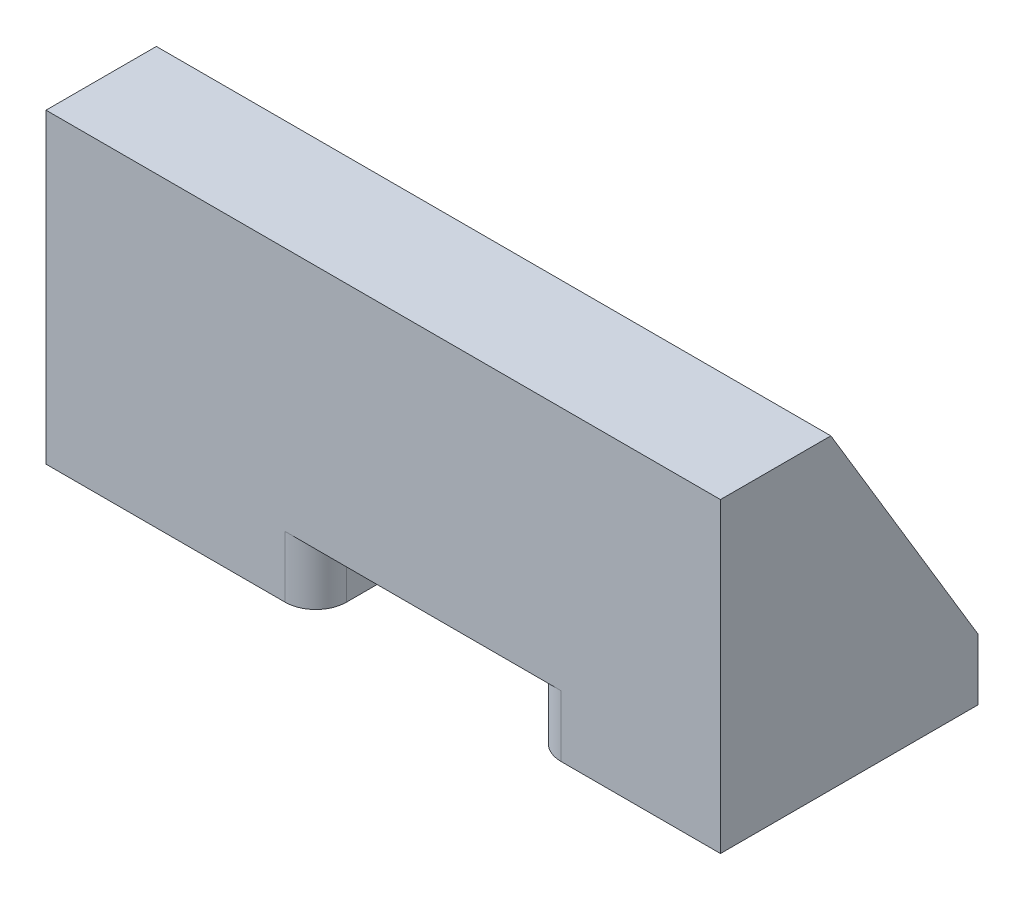
ISO-10303-21;
HEADER;
FILE_DESCRIPTION(('STEP AP214'),'2;1');
FILE_NAME('part.step','',(''),(''),'','','');
FILE_SCHEMA(('AUTOMOTIVE_DESIGN { 1 0 10303 214 1 1 1 1 }'));
ENDSEC;
DATA;
#1=APPLICATION_CONTEXT('core data for automotive mechanical design processes');
#2=APPLICATION_PROTOCOL_DEFINITION('international standard','automotive_design',2000,#1);
#3=PRODUCT_CONTEXT('',#1,'mechanical');
#4=PRODUCT('Part','Part','',(#3));
#5=PRODUCT_RELATED_PRODUCT_CATEGORY('part','',(#4));
#6=PRODUCT_DEFINITION_FORMATION('','',#4);
#7=PRODUCT_DEFINITION_CONTEXT('part definition',#1,'design');
#8=PRODUCT_DEFINITION('design','',#6,#7);
#9=PRODUCT_DEFINITION_SHAPE('','',#8);
#10=(LENGTH_UNIT() NAMED_UNIT(*) SI_UNIT(.MILLI.,.METRE.));
#11=(NAMED_UNIT(*) PLANE_ANGLE_UNIT() SI_UNIT($,.RADIAN.));
#12=(NAMED_UNIT(*) SI_UNIT($,.STERADIAN.) SOLID_ANGLE_UNIT());
#13=UNCERTAINTY_MEASURE_WITH_UNIT(LENGTH_MEASURE(1.E-05),#10,'distance_accuracy_value','');
#14=(GEOMETRIC_REPRESENTATION_CONTEXT(3) GLOBAL_UNCERTAINTY_ASSIGNED_CONTEXT((#13)) GLOBAL_UNIT_ASSIGNED_CONTEXT((#10,
#11,#12)) REPRESENTATION_CONTEXT('',''));
#15=CARTESIAN_POINT('',(0.,0.,0.));
#16=DIRECTION('',(0.,0.,1.));
#17=DIRECTION('',(1.,0.,0.));
#18=AXIS2_PLACEMENT_3D('',#15,#16,#17);
#19=CARTESIAN_POINT('',(0.,10.,0.));
#20=DIRECTION('',(0.,-1.,0.));
#21=DIRECTION('',(0.,0.,-1.));
#22=AXIS2_PLACEMENT_3D('',#19,#20,#21);
#23=PLANE('',#22);
#24=CARTESIAN_POINT('',(-45.,10.,-8.));
#25=DIRECTION('',(0.,1.,0.));
#26=DIRECTION('',(0.,0.,1.));
#27=AXIS2_PLACEMENT_3D('',#24,#25,#26);
#28=CIRCLE('',#27,3.99999999999999);
#29=CARTESIAN_POINT('',(-45.,10.,-4.00000000000001));
#30=VERTEX_POINT('',#29);
#31=EDGE_CURVE('E291',#30,#30,#28,.T.);
#32=ORIENTED_EDGE('',*,*,#31,.F.);
#33=EDGE_LOOP('',(#32));
#34=FACE_BOUND('',#33,.T.);
#35=CARTESIAN_POINT('',(-32.,10.,-3.));
#36=DIRECTION('',(0.,1.,0.));
#37=DIRECTION('',(0.,0.,1.));
#38=AXIS2_PLACEMENT_3D('',#35,#36,#37);
#39=CIRCLE('',#38,3.99999999999999);
#40=CARTESIAN_POINT('',(-32.,10.,0.99999999999999));
#41=VERTEX_POINT('',#40);
#42=EDGE_CURVE('E303',#41,#41,#39,.T.);
#43=ORIENTED_EDGE('',*,*,#42,.F.);
#44=EDGE_LOOP('',(#43));
#45=FACE_BOUND('',#44,.T.);
#46=CARTESIAN_POINT('',(32.,10.,-3.));
#47=DIRECTION('',(0.,1.,0.));
#48=DIRECTION('',(0.,0.,1.));
#49=AXIS2_PLACEMENT_3D('',#46,#47,#48);
#50=CIRCLE('',#49,4.);
#51=CARTESIAN_POINT('',(32.,10.,0.999999999999993));
#52=VERTEX_POINT('',#51);
#53=EDGE_CURVE('E315',#52,#52,#50,.T.);
#54=ORIENTED_EDGE('',*,*,#53,.F.);
#55=EDGE_LOOP('',(#54));
#56=FACE_BOUND('',#55,.T.);
#57=CARTESIAN_POINT('',(45.,10.,-8.));
#58=DIRECTION('',(0.,1.,0.));
#59=DIRECTION('',(0.,0.,1.));
#60=AXIS2_PLACEMENT_3D('',#57,#58,#59);
#61=CIRCLE('',#60,4.);
#62=CARTESIAN_POINT('',(45.,10.,-4.00000000000001));
#63=VERTEX_POINT('',#62);
#64=EDGE_CURVE('E327',#63,#63,#61,.T.);
#65=ORIENTED_EDGE('',*,*,#64,.F.);
#66=EDGE_LOOP('',(#65));
#67=FACE_BOUND('',#66,.T.);
#68=DIRECTION('',(0.,0.,-1.));
#69=VECTOR('',#68,1.);
#70=CARTESIAN_POINT('',(50.,10.,3.00000000000002));
#71=LINE('',#70,#69);
#72=CARTESIAN_POINT('',(50.,10.,3.00000000000002));
#73=VERTEX_POINT('',#72);
#74=CARTESIAN_POINT('',(50.,10.,-21.));
#75=VERTEX_POINT('',#74);
#76=EDGE_CURVE('E211',#73,#75,#71,.T.);
#77=ORIENTED_EDGE('',*,*,#76,.T.);
#78=DIRECTION('',(-1.,0.,0.));
#79=VECTOR('',#78,1.);
#80=CARTESIAN_POINT('',(-55.,10.,-21.));
#81=LINE('',#80,#79);
#82=CARTESIAN_POINT('',(-50.,10.,-21.));
#83=VERTEX_POINT('',#82);
#84=EDGE_CURVE('E343',#75,#83,#81,.T.);
#85=ORIENTED_EDGE('',*,*,#84,.T.);
#86=DIRECTION('',(0.,0.,1.));
#87=VECTOR('',#86,1.);
#88=CARTESIAN_POINT('',(-50.,10.,-21.));
#89=LINE('',#88,#87);
#90=CARTESIAN_POINT('',(-50.,10.,3.));
#91=VERTEX_POINT('',#90);
#92=EDGE_CURVE('E222',#83,#91,#89,.T.);
#93=ORIENTED_EDGE('',*,*,#92,.T.);
#94=DIRECTION('',(-1.,0.,0.));
#95=VECTOR('',#94,1.);
#96=CARTESIAN_POINT('',(-55.,10.,3.));
#97=LINE('',#96,#95);
#98=CARTESIAN_POINT('',(-16.,10.,3.));
#99=VERTEX_POINT('',#98);
#100=EDGE_CURVE('E387',#99,#91,#97,.T.);
#101=ORIENTED_EDGE('',*,*,#100,.F.);
#102=CARTESIAN_POINT('',(-16.,10.,8.));
#103=DIRECTION('',(0.,-1.,0.));
#104=DIRECTION('',(0.,0.,-1.));
#105=AXIS2_PLACEMENT_3D('',#102,#103,#104);
#106=CIRCLE('',#105,5.);
#107=CARTESIAN_POINT('',(-11.,10.,8.));
#108=VERTEX_POINT('',#107);
#109=EDGE_CURVE('E11',#99,#108,#106,.T.);
#110=ORIENTED_EDGE('',*,*,#109,.T.);
#111=DIRECTION('',(0.,0.,1.));
#112=VECTOR('',#111,1.);
#113=CARTESIAN_POINT('',(-11.,10.,-5.99999999999999));
#114=LINE('',#113,#112);
#115=CARTESIAN_POINT('',(-11.,10.,-5.99999999999999));
#116=VERTEX_POINT('',#115);
#117=EDGE_CURVE('E50',#116,#108,#114,.T.);
#118=ORIENTED_EDGE('',*,*,#117,.F.);
#119=CARTESIAN_POINT('',(-6.,10.,-6.));
#120=DIRECTION('',(0.,1.,0.));
#121=DIRECTION('',(0.,0.,1.));
#122=AXIS2_PLACEMENT_3D('',#119,#120,#121);
#123=CIRCLE('',#122,5.);
#124=CARTESIAN_POINT('',(-6.,10.,-11.));
#125=VERTEX_POINT('',#124);
#126=EDGE_CURVE('E250',#125,#116,#123,.T.);
#127=ORIENTED_EDGE('',*,*,#126,.F.);
#128=DIRECTION('',(-1.,0.,0.));
#129=VECTOR('',#128,1.);
#130=CARTESIAN_POINT('',(19.,10.,-11.));
#131=LINE('',#130,#129);
#132=CARTESIAN_POINT('',(19.,10.,-11.));
#133=VERTEX_POINT('',#132);
#134=EDGE_CURVE('E257',#133,#125,#131,.T.);
#135=ORIENTED_EDGE('',*,*,#134,.F.);
#136=CARTESIAN_POINT('',(19.,10.,-6.));
#137=DIRECTION('',(0.,1.,0.));
#138=DIRECTION('',(0.,0.,-1.));
#139=AXIS2_PLACEMENT_3D('',#136,#137,#138);
#140=CIRCLE('',#139,5.);
#141=CARTESIAN_POINT('',(24.,10.,-6.));
#142=VERTEX_POINT('',#141);
#143=EDGE_CURVE('E261',#142,#133,#140,.T.);
#144=ORIENTED_EDGE('',*,*,#143,.F.);
#145=DIRECTION('',(0.,0.,-1.));
#146=VECTOR('',#145,1.);
#147=CARTESIAN_POINT('',(24.,10.,21.));
#148=LINE('',#147,#146);
#149=CARTESIAN_POINT('',(24.,10.,8.));
#150=VERTEX_POINT('',#149);
#151=EDGE_CURVE('E264',#150,#142,#148,.T.);
#152=ORIENTED_EDGE('',*,*,#151,.F.);
#153=CARTESIAN_POINT('',(29.,10.,8.));
#154=DIRECTION('',(0.,-1.,0.));
#155=DIRECTION('',(0.,0.,-1.));
#156=AXIS2_PLACEMENT_3D('',#153,#154,#155);
#157=CIRCLE('',#156,5.);
#158=CARTESIAN_POINT('',(29.,10.,3.));
#159=VERTEX_POINT('',#158);
#160=EDGE_CURVE('E42',#150,#159,#157,.T.);
#161=ORIENTED_EDGE('',*,*,#160,.T.);
#162=EDGE_CURVE('E240',#73,#159,#97,.T.);
#163=ORIENTED_EDGE('',*,*,#162,.F.);
#164=EDGE_LOOP('',(#77,#85,#93,#101,#110,#118,#127,#135,#144,#152,#161,#163));
#165=FACE_BOUND('',#164,.T.);
#166=ADVANCED_FACE('F33',(#34,#45,#56,#67,#165),#23,.F.);
#167=CARTESIAN_POINT('',(-55.,50.,3.));
#168=DIRECTION('',(0.,0.,1.));
#169=DIRECTION('',(1.,0.,0.));
#170=AXIS2_PLACEMENT_3D('',#167,#168,#169);
#171=PLANE('',#170);
#172=ORIENTED_EDGE('',*,*,#162,.T.);
#173=DIRECTION('',(0.,-1.,0.));
#174=VECTOR('',#173,1.);
#175=CARTESIAN_POINT('',(29.,50.,3.));
#176=LINE('',#175,#174);
#177=CARTESIAN_POINT('',(29.,30.,3.));
#178=VERTEX_POINT('',#177);
#179=EDGE_CURVE('E393',#159,#178,#176,.F.);
#180=ORIENTED_EDGE('',*,*,#179,.T.);
#181=DIRECTION('',(1.,0.,0.));
#182=VECTOR('',#181,1.);
#183=CARTESIAN_POINT('',(-11.,30.,3.));
#184=LINE('',#183,#182);
#185=CARTESIAN_POINT('',(-16.,30.,3.));
#186=VERTEX_POINT('',#185);
#187=EDGE_CURVE('E391',#178,#186,#184,.F.);
#188=ORIENTED_EDGE('',*,*,#187,.T.);
#189=DIRECTION('',(0.,-1.,0.));
#190=VECTOR('',#189,1.);
#191=CARTESIAN_POINT('',(-16.,50.,3.));
#192=LINE('',#191,#190);
#193=EDGE_CURVE('E386',#186,#99,#192,.T.);
#194=ORIENTED_EDGE('',*,*,#193,.T.);
#195=ORIENTED_EDGE('',*,*,#100,.T.);
#196=DIRECTION('',(0.,1.,0.));
#197=VECTOR('',#196,1.);
#198=CARTESIAN_POINT('',(-50.,10.,3.));
#199=LINE('',#198,#197);
#200=CARTESIAN_POINT('',(-50.,50.,3.));
#201=VERTEX_POINT('',#200);
#202=EDGE_CURVE('E225',#91,#201,#199,.T.);
#203=ORIENTED_EDGE('',*,*,#202,.T.);
#204=DIRECTION('',(-1.,0.,0.));
#205=VECTOR('',#204,1.);
#206=CARTESIAN_POINT('',(-55.,50.,3.));
#207=LINE('',#206,#205);
#208=CARTESIAN_POINT('',(50.,50.,3.));
#209=VERTEX_POINT('',#208);
#210=EDGE_CURVE('E246',#209,#201,#207,.T.);
#211=ORIENTED_EDGE('',*,*,#210,.F.);
#212=DIRECTION('',(0.,-1.,0.));
#213=VECTOR('',#212,1.);
#214=CARTESIAN_POINT('',(50.,50.,3.));
#215=LINE('',#214,#213);
#216=EDGE_CURVE('E208',#209,#73,#215,.T.);
#217=ORIENTED_EDGE('',*,*,#216,.T.);
#218=EDGE_LOOP('',(#172,#180,#188,#194,#195,#203,#211,#217));
#219=FACE_BOUND('',#218,.T.);
#220=ADVANCED_FACE('F412',(#219),#171,.F.);
#221=CARTESIAN_POINT('',(55.,10.,21.));
#222=DIRECTION('',(-1.,0.,0.));
#223=DIRECTION('',(0.,0.,1.));
#224=AXIS2_PLACEMENT_3D('',#221,#222,#223);
#225=PLANE('',#224);
#226=DIRECTION('',(0.,0.,-1.));
#227=VECTOR('',#226,1.);
#228=CARTESIAN_POINT('',(55.,0.,21.));
#229=LINE('',#228,#227);
#230=CARTESIAN_POINT('',(55.,0.,21.));
#231=VERTEX_POINT('',#230);
#232=CARTESIAN_POINT('',(55.,0.,-21.));
#233=VERTEX_POINT('',#232);
#234=EDGE_CURVE('E339',#231,#233,#229,.T.);
#235=ORIENTED_EDGE('',*,*,#234,.T.);
#236=DIRECTION('',(0.,-1.,0.));
#237=VECTOR('',#236,1.);
#238=CARTESIAN_POINT('',(55.,10.,-21.));
#239=LINE('',#238,#237);
#240=CARTESIAN_POINT('',(55.,10.,-21.));
#241=VERTEX_POINT('',#240);
#242=EDGE_CURVE('E362',#241,#233,#239,.T.);
#243=ORIENTED_EDGE('',*,*,#242,.F.);
#244=DIRECTION('',(0.,0.857492925712544,0.514495755427527));
#245=VECTOR('',#244,1.);
#246=CARTESIAN_POINT('',(55.,10.,-21.));
#247=LINE('',#246,#245);
#248=CARTESIAN_POINT('',(55.,50.,3.));
#249=VERTEX_POINT('',#248);
#250=EDGE_CURVE('E206',#241,#249,#247,.T.);
#251=ORIENTED_EDGE('',*,*,#250,.T.);
#252=DIRECTION('',(0.,0.,-1.));
#253=VECTOR('',#252,1.);
#254=CARTESIAN_POINT('',(55.,50.,21.));
#255=LINE('',#254,#253);
#256=CARTESIAN_POINT('',(55.,50.,21.));
#257=VERTEX_POINT('',#256);
#258=EDGE_CURVE('E243',#257,#249,#255,.T.);
#259=ORIENTED_EDGE('',*,*,#258,.F.);
#260=DIRECTION('',(0.,-1.,0.));
#261=VECTOR('',#260,1.);
#262=CARTESIAN_POINT('',(55.,10.,21.));
#263=LINE('',#262,#261);
#264=EDGE_CURVE('E342',#257,#231,#263,.T.);
#265=ORIENTED_EDGE('',*,*,#264,.T.);
#266=EDGE_LOOP('',(#235,#243,#251,#259,#265));
#267=FACE_BOUND('',#266,.T.);
#268=ADVANCED_FACE('F481',(#267),#225,.F.);
#269=CARTESIAN_POINT('',(-55.,10.,-21.));
#270=DIRECTION('',(0.,0.,1.));
#271=DIRECTION('',(1.,0.,0.));
#272=AXIS2_PLACEMENT_3D('',#269,#270,#271);
#273=PLANE('',#272);
#274=DIRECTION('',(-1.,0.,0.));
#275=VECTOR('',#274,1.);
#276=CARTESIAN_POINT('',(-55.,0.,-21.));
#277=LINE('',#276,#275);
#278=CARTESIAN_POINT('',(-55.,0.,-21.));
#279=VERTEX_POINT('',#278);
#280=EDGE_CURVE('E346',#233,#279,#277,.T.);
#281=ORIENTED_EDGE('',*,*,#280,.T.);
#282=DIRECTION('',(0.,-1.,0.));
#283=VECTOR('',#282,1.);
#284=CARTESIAN_POINT('',(-55.,10.,-21.));
#285=LINE('',#284,#283);
#286=CARTESIAN_POINT('',(-55.,10.,-21.));
#287=VERTEX_POINT('',#286);
#288=EDGE_CURVE('E359',#287,#279,#285,.T.);
#289=ORIENTED_EDGE('',*,*,#288,.F.);
#290=DIRECTION('',(-1.,0.,0.));
#291=VECTOR('',#290,1.);
#292=CARTESIAN_POINT('',(-50.,10.,-21.));
#293=LINE('',#292,#291);
#294=EDGE_CURVE('E228',#83,#287,#293,.T.);
#295=ORIENTED_EDGE('',*,*,#294,.F.);
#296=ORIENTED_EDGE('',*,*,#84,.F.);
#297=EDGE_CURVE('E340',#241,#75,#81,.T.);
#298=ORIENTED_EDGE('',*,*,#297,.F.);
#299=ORIENTED_EDGE('',*,*,#242,.T.);
#300=EDGE_LOOP('',(#281,#289,#295,#296,#298,#299));
#301=FACE_BOUND('',#300,.T.);
#302=ADVANCED_FACE('F426',(#301),#273,.F.);
#303=CARTESIAN_POINT('',(-55.,10.,21.));
#304=DIRECTION('',(1.,0.,0.));
#305=DIRECTION('',(0.,0.,-1.));
#306=AXIS2_PLACEMENT_3D('',#303,#304,#305);
#307=PLANE('',#306);
#308=DIRECTION('',(0.,0.,1.));
#309=VECTOR('',#308,1.);
#310=CARTESIAN_POINT('',(-55.,0.,21.));
#311=LINE('',#310,#309);
#312=CARTESIAN_POINT('',(-55.,0.,21.));
#313=VERTEX_POINT('',#312);
#314=EDGE_CURVE('E348',#279,#313,#311,.T.);
#315=ORIENTED_EDGE('',*,*,#314,.T.);
#316=DIRECTION('',(0.,-1.,0.));
#317=VECTOR('',#316,1.);
#318=CARTESIAN_POINT('',(-55.,10.,21.));
#319=LINE('',#318,#317);
#320=CARTESIAN_POINT('',(-55.,50.,21.));
#321=VERTEX_POINT('',#320);
#322=EDGE_CURVE('E356',#321,#313,#319,.T.);
#323=ORIENTED_EDGE('',*,*,#322,.F.);
#324=DIRECTION('',(0.,0.,1.));
#325=VECTOR('',#324,1.);
#326=CARTESIAN_POINT('',(-55.,50.,21.));
#327=LINE('',#326,#325);
#328=CARTESIAN_POINT('',(-55.,50.,3.));
#329=VERTEX_POINT('',#328);
#330=EDGE_CURVE('E236',#329,#321,#327,.T.);
#331=ORIENTED_EDGE('',*,*,#330,.F.);
#332=DIRECTION('',(0.,-0.857492925712544,-0.514495755427527));
#333=VECTOR('',#332,1.);
#334=CARTESIAN_POINT('',(-55.,50.,3.));
#335=LINE('',#334,#333);
#336=EDGE_CURVE('E216',#329,#287,#335,.T.);
#337=ORIENTED_EDGE('',*,*,#336,.T.);
#338=ORIENTED_EDGE('',*,*,#288,.T.);
#339=EDGE_LOOP('',(#315,#323,#331,#337,#338));
#340=FACE_BOUND('',#339,.T.);
#341=ADVANCED_FACE('F430',(#340),#307,.F.);
#342=CARTESIAN_POINT('',(-55.,10.,21.));
#343=DIRECTION('',(0.,0.,-1.));
#344=DIRECTION('',(-1.,0.,0.));
#345=AXIS2_PLACEMENT_3D('',#342,#343,#344);
#346=PLANE('',#345);
#347=ORIENTED_EDGE('',*,*,#264,.F.);
#348=DIRECTION('',(1.,0.,0.));
#349=VECTOR('',#348,1.);
#350=CARTESIAN_POINT('',(-55.,50.,21.));
#351=LINE('',#350,#349);
#352=EDGE_CURVE('E239',#321,#257,#351,.T.);
#353=ORIENTED_EDGE('',*,*,#352,.F.);
#354=ORIENTED_EDGE('',*,*,#322,.T.);
#355=DIRECTION('',(1.,0.,0.));
#356=VECTOR('',#355,1.);
#357=CARTESIAN_POINT('',(-55.,0.,21.));
#358=LINE('',#357,#356);
#359=CARTESIAN_POINT('',(-16.,0.,21.));
#360=VERTEX_POINT('',#359);
#361=EDGE_CURVE('E351',#313,#360,#358,.T.);
#362=ORIENTED_EDGE('',*,*,#361,.T.);
#363=DIRECTION('',(0.,1.,0.));
#364=VECTOR('',#363,1.);
#365=CARTESIAN_POINT('',(-16.,10.,21.));
#366=LINE('',#365,#364);
#367=CARTESIAN_POINT('',(-16.,10.,21.));
#368=VERTEX_POINT('',#367);
#369=EDGE_CURVE('E443',#360,#368,#366,.T.);
#370=ORIENTED_EDGE('',*,*,#369,.T.);
#371=DIRECTION('',(1.,0.,0.));
#372=VECTOR('',#371,1.);
#373=CARTESIAN_POINT('',(-55.,10.,21.));
#374=LINE('',#373,#372);
#375=CARTESIAN_POINT('',(29.,10.,21.));
#376=VERTEX_POINT('',#375);
#377=EDGE_CURVE('E234',#368,#376,#374,.T.);
#378=ORIENTED_EDGE('',*,*,#377,.T.);
#379=DIRECTION('',(0.,1.,0.));
#380=VECTOR('',#379,1.);
#381=CARTESIAN_POINT('',(29.,10.,21.));
#382=LINE('',#381,#380);
#383=CARTESIAN_POINT('',(29.,0.,21.));
#384=VERTEX_POINT('',#383);
#385=EDGE_CURVE('E376',#376,#384,#382,.F.);
#386=ORIENTED_EDGE('',*,*,#385,.T.);
#387=EDGE_CURVE('E350',#384,#231,#358,.T.);
#388=ORIENTED_EDGE('',*,*,#387,.T.);
#389=EDGE_LOOP('',(#347,#353,#354,#362,#370,#378,#386,#388));
#390=FACE_BOUND('',#389,.T.);
#391=ADVANCED_FACE('F442',(#390),#346,.F.);
#392=CARTESIAN_POINT('',(0.,0.,0.));
#393=DIRECTION('',(0.,-1.,0.));
#394=DIRECTION('',(0.,0.,-1.));
#395=AXIS2_PLACEMENT_3D('',#392,#393,#394);
#396=PLANE('',#395);
#397=ORIENTED_EDGE('',*,*,#387,.F.);
#398=CARTESIAN_POINT('',(29.,0.,16.));
#399=DIRECTION('',(0.,-1.,0.));
#400=DIRECTION('',(0.,0.,-1.));
#401=AXIS2_PLACEMENT_3D('',#398,#399,#400);
#402=CIRCLE('',#401,5.);
#403=CARTESIAN_POINT('',(24.,0.,16.));
#404=VERTEX_POINT('',#403);
#405=EDGE_CURVE('E450',#384,#404,#402,.T.);
#406=ORIENTED_EDGE('',*,*,#405,.T.);
#407=DIRECTION('',(0.,0.,-1.));
#408=VECTOR('',#407,1.);
#409=CARTESIAN_POINT('',(24.,0.,21.));
#410=LINE('',#409,#408);
#411=CARTESIAN_POINT('',(24.,0.,-5.99999999999999));
#412=VERTEX_POINT('',#411);
#413=EDGE_CURVE('E271',#404,#412,#410,.T.);
#414=ORIENTED_EDGE('',*,*,#413,.T.);
#415=CARTESIAN_POINT('',(19.,0.,-6.));
#416=DIRECTION('',(0.,-1.,0.));
#417=DIRECTION('',(0.,0.,-1.));
#418=AXIS2_PLACEMENT_3D('',#415,#416,#417);
#419=CIRCLE('',#418,5.);
#420=CARTESIAN_POINT('',(19.,0.,-11.));
#421=VERTEX_POINT('',#420);
#422=EDGE_CURVE('E281',#412,#421,#419,.F.);
#423=ORIENTED_EDGE('',*,*,#422,.T.);
#424=DIRECTION('',(-1.,0.,0.));
#425=VECTOR('',#424,1.);
#426=CARTESIAN_POINT('',(19.,0.,-11.));
#427=LINE('',#426,#425);
#428=CARTESIAN_POINT('',(-5.99999999999999,0.,-11.));
#429=VERTEX_POINT('',#428);
#430=EDGE_CURVE('E277',#421,#429,#427,.T.);
#431=ORIENTED_EDGE('',*,*,#430,.T.);
#432=CARTESIAN_POINT('',(-6.,0.,-6.));
#433=DIRECTION('',(0.,-1.,0.));
#434=DIRECTION('',(0.,0.,-1.));
#435=AXIS2_PLACEMENT_3D('',#432,#433,#434);
#436=CIRCLE('',#435,5.);
#437=CARTESIAN_POINT('',(-11.,0.,-5.99999999999999));
#438=VERTEX_POINT('',#437);
#439=EDGE_CURVE('E272',#429,#438,#436,.F.);
#440=ORIENTED_EDGE('',*,*,#439,.T.);
#441=DIRECTION('',(0.,0.,1.));
#442=VECTOR('',#441,1.);
#443=CARTESIAN_POINT('',(-11.,0.,-5.99999999999999));
#444=LINE('',#443,#442);
#445=CARTESIAN_POINT('',(-11.,0.,16.));
#446=VERTEX_POINT('',#445);
#447=EDGE_CURVE('E260',#438,#446,#444,.T.);
#448=ORIENTED_EDGE('',*,*,#447,.T.);
#449=CARTESIAN_POINT('',(-16.,0.,16.));
#450=DIRECTION('',(0.,-1.,0.));
#451=DIRECTION('',(0.,0.,-1.));
#452=AXIS2_PLACEMENT_3D('',#449,#450,#451);
#453=CIRCLE('',#452,5.);
#454=EDGE_CURVE('E369',#446,#360,#453,.T.);
#455=ORIENTED_EDGE('',*,*,#454,.T.);
#456=ORIENTED_EDGE('',*,*,#361,.F.);
#457=ORIENTED_EDGE('',*,*,#314,.F.);
#458=ORIENTED_EDGE('',*,*,#280,.F.);
#459=ORIENTED_EDGE('',*,*,#234,.F.);
#460=EDGE_LOOP('',(#397,#406,#414,#423,#431,#440,#448,#455,#456,#457,#458,#459));
#461=FACE_BOUND('',#460,.T.);
#462=CARTESIAN_POINT('',(-45.,0.,-8.));
#463=DIRECTION('',(0.,1.,0.));
#464=DIRECTION('',(0.,0.,1.));
#465=AXIS2_PLACEMENT_3D('',#462,#463,#464);
#466=CIRCLE('',#465,1.7);
#467=CARTESIAN_POINT('',(-45.,0.,-6.3));
#468=VERTEX_POINT('',#467);
#469=EDGE_CURVE('E300',#468,#468,#466,.T.);
#470=ORIENTED_EDGE('',*,*,#469,.T.);
#471=EDGE_LOOP('',(#470));
#472=FACE_BOUND('',#471,.T.);
#473=CARTESIAN_POINT('',(-32.,0.,-3.));
#474=DIRECTION('',(0.,1.,0.));
#475=DIRECTION('',(0.,0.,1.));
#476=AXIS2_PLACEMENT_3D('',#473,#474,#475);
#477=CIRCLE('',#476,1.7);
#478=CARTESIAN_POINT('',(-32.,0.,-1.30000000000001));
#479=VERTEX_POINT('',#478);
#480=EDGE_CURVE('E312',#479,#479,#477,.T.);
#481=ORIENTED_EDGE('',*,*,#480,.T.);
#482=EDGE_LOOP('',(#481));
#483=FACE_BOUND('',#482,.T.);
#484=CARTESIAN_POINT('',(32.,0.,-3.));
#485=DIRECTION('',(0.,1.,0.));
#486=DIRECTION('',(0.,0.,1.));
#487=AXIS2_PLACEMENT_3D('',#484,#485,#486);
#488=CIRCLE('',#487,1.7);
#489=CARTESIAN_POINT('',(32.,0.,-1.3));
#490=VERTEX_POINT('',#489);
#491=EDGE_CURVE('E324',#490,#490,#488,.T.);
#492=ORIENTED_EDGE('',*,*,#491,.T.);
#493=EDGE_LOOP('',(#492));
#494=FACE_BOUND('',#493,.T.);
#495=CARTESIAN_POINT('',(45.,0.,-8.));
#496=DIRECTION('',(0.,1.,0.));
#497=DIRECTION('',(0.,0.,1.));
#498=AXIS2_PLACEMENT_3D('',#495,#496,#497);
#499=CIRCLE('',#498,1.7);
#500=CARTESIAN_POINT('',(45.,0.,-6.3));
#501=VERTEX_POINT('',#500);
#502=EDGE_CURVE('E336',#501,#501,#499,.T.);
#503=ORIENTED_EDGE('',*,*,#502,.T.);
#504=EDGE_LOOP('',(#503));
#505=FACE_BOUND('',#504,.T.);
#506=ADVANCED_FACE('F435',(#461,#472,#483,#494,#505),#396,.T.);
#507=CARTESIAN_POINT('',(45.,10.,-8.));
#508=DIRECTION('',(0.,1.,0.));
#509=DIRECTION('',(0.,0.,1.));
#510=AXIS2_PLACEMENT_3D('',#507,#508,#509);
#511=CYLINDRICAL_SURFACE('',#510,1.7);
#512=ORIENTED_EDGE('',*,*,#502,.F.);
#513=EDGE_LOOP('',(#512));
#514=FACE_BOUND('',#513,.T.);
#515=CARTESIAN_POINT('',(45.,5.,-8.));
#516=DIRECTION('',(0.,1.,0.));
#517=DIRECTION('',(0.,0.,1.));
#518=AXIS2_PLACEMENT_3D('',#515,#516,#517);
#519=CIRCLE('',#518,1.7);
#520=CARTESIAN_POINT('',(45.,5.,-6.3));
#521=VERTEX_POINT('',#520);
#522=EDGE_CURVE('E333',#521,#521,#519,.T.);
#523=ORIENTED_EDGE('',*,*,#522,.T.);
#524=EDGE_LOOP('',(#523));
#525=FACE_BOUND('',#524,.T.);
#526=ADVANCED_FACE('F487',(#514,#525),#511,.F.);
#527=CARTESIAN_POINT('',(46.7,5.,-8.));
#528=DIRECTION('',(0.,-1.,0.));
#529=DIRECTION('',(0.,0.,-1.));
#530=AXIS2_PLACEMENT_3D('',#527,#528,#529);
#531=PLANE('',#530);
#532=ORIENTED_EDGE('',*,*,#522,.F.);
#533=EDGE_LOOP('',(#532));
#534=FACE_BOUND('',#533,.T.);
#535=CARTESIAN_POINT('',(45.,5.,-8.));
#536=DIRECTION('',(0.,1.,0.));
#537=DIRECTION('',(0.,0.,1.));
#538=AXIS2_PLACEMENT_3D('',#535,#536,#537);
#539=CIRCLE('',#538,4.);
#540=CARTESIAN_POINT('',(45.,5.,-4.00000000000001));
#541=VERTEX_POINT('',#540);
#542=EDGE_CURVE('E330',#541,#541,#539,.T.);
#543=ORIENTED_EDGE('',*,*,#542,.T.);
#544=EDGE_LOOP('',(#543));
#545=FACE_BOUND('',#544,.T.);
#546=ADVANCED_FACE('F571',(#534,#545),#531,.F.);
#547=CARTESIAN_POINT('',(45.,10.,-8.));
#548=DIRECTION('',(0.,1.,0.));
#549=DIRECTION('',(0.,0.,1.));
#550=AXIS2_PLACEMENT_3D('',#547,#548,#549);
#551=CYLINDRICAL_SURFACE('',#550,4.);
#552=ORIENTED_EDGE('',*,*,#542,.F.);
#553=EDGE_LOOP('',(#552));
#554=FACE_BOUND('',#553,.T.);
#555=ORIENTED_EDGE('',*,*,#64,.T.);
#556=EDGE_LOOP('',(#555));
#557=FACE_BOUND('',#556,.T.);
#558=ADVANCED_FACE('F568',(#554,#557),#551,.F.);
#559=CARTESIAN_POINT('',(32.,10.,-3.));
#560=DIRECTION('',(0.,1.,0.));
#561=DIRECTION('',(0.,0.,1.));
#562=AXIS2_PLACEMENT_3D('',#559,#560,#561);
#563=CYLINDRICAL_SURFACE('',#562,1.7);
#564=ORIENTED_EDGE('',*,*,#491,.F.);
#565=EDGE_LOOP('',(#564));
#566=FACE_BOUND('',#565,.T.);
#567=CARTESIAN_POINT('',(32.,5.,-3.));
#568=DIRECTION('',(0.,1.,0.));
#569=DIRECTION('',(0.,0.,1.));
#570=AXIS2_PLACEMENT_3D('',#567,#568,#569);
#571=CIRCLE('',#570,1.7);
#572=CARTESIAN_POINT('',(32.,5.,-1.3));
#573=VERTEX_POINT('',#572);
#574=EDGE_CURVE('E321',#573,#573,#571,.T.);
#575=ORIENTED_EDGE('',*,*,#574,.T.);
#576=EDGE_LOOP('',(#575));
#577=FACE_BOUND('',#576,.T.);
#578=ADVANCED_FACE('F564',(#566,#577),#563,.F.);
#579=CARTESIAN_POINT('',(33.7,5.,-3.));
#580=DIRECTION('',(0.,-1.,0.));
#581=DIRECTION('',(0.,0.,-1.));
#582=AXIS2_PLACEMENT_3D('',#579,#580,#581);
#583=PLANE('',#582);
#584=ORIENTED_EDGE('',*,*,#574,.F.);
#585=EDGE_LOOP('',(#584));
#586=FACE_BOUND('',#585,.T.);
#587=CARTESIAN_POINT('',(32.,5.,-3.));
#588=DIRECTION('',(0.,1.,0.));
#589=DIRECTION('',(0.,0.,1.));
#590=AXIS2_PLACEMENT_3D('',#587,#588,#589);
#591=CIRCLE('',#590,4.);
#592=CARTESIAN_POINT('',(32.,5.,0.999999999999993));
#593=VERTEX_POINT('',#592);
#594=EDGE_CURVE('E318',#593,#593,#591,.T.);
#595=ORIENTED_EDGE('',*,*,#594,.T.);
#596=EDGE_LOOP('',(#595));
#597=FACE_BOUND('',#596,.T.);
#598=ADVANCED_FACE('F560',(#586,#597),#583,.F.);
#599=CARTESIAN_POINT('',(32.,10.,-3.));
#600=DIRECTION('',(0.,1.,0.));
#601=DIRECTION('',(0.,0.,1.));
#602=AXIS2_PLACEMENT_3D('',#599,#600,#601);
#603=CYLINDRICAL_SURFACE('',#602,4.);
#604=ORIENTED_EDGE('',*,*,#594,.F.);
#605=EDGE_LOOP('',(#604));
#606=FACE_BOUND('',#605,.T.);
#607=ORIENTED_EDGE('',*,*,#53,.T.);
#608=EDGE_LOOP('',(#607));
#609=FACE_BOUND('',#608,.T.);
#610=ADVANCED_FACE('F556',(#606,#609),#603,.F.);
#611=CARTESIAN_POINT('',(-32.,10.,-3.));
#612=DIRECTION('',(0.,1.,0.));
#613=DIRECTION('',(0.,0.,1.));
#614=AXIS2_PLACEMENT_3D('',#611,#612,#613);
#615=CYLINDRICAL_SURFACE('',#614,1.7);
#616=ORIENTED_EDGE('',*,*,#480,.F.);
#617=EDGE_LOOP('',(#616));
#618=FACE_BOUND('',#617,.T.);
#619=CARTESIAN_POINT('',(-32.,5.,-3.));
#620=DIRECTION('',(0.,1.,0.));
#621=DIRECTION('',(0.,0.,1.));
#622=AXIS2_PLACEMENT_3D('',#619,#620,#621);
#623=CIRCLE('',#622,1.7);
#624=CARTESIAN_POINT('',(-32.,5.,-1.3));
#625=VERTEX_POINT('',#624);
#626=EDGE_CURVE('E309',#625,#625,#623,.T.);
#627=ORIENTED_EDGE('',*,*,#626,.T.);
#628=EDGE_LOOP('',(#627));
#629=FACE_BOUND('',#628,.T.);
#630=ADVANCED_FACE('F552',(#618,#629),#615,.F.);
#631=CARTESIAN_POINT('',(-30.3,5.,-3.));
#632=DIRECTION('',(0.,-1.,0.));
#633=DIRECTION('',(0.,0.,-1.));
#634=AXIS2_PLACEMENT_3D('',#631,#632,#633);
#635=PLANE('',#634);
#636=ORIENTED_EDGE('',*,*,#626,.F.);
#637=EDGE_LOOP('',(#636));
#638=FACE_BOUND('',#637,.T.);
#639=CARTESIAN_POINT('',(-32.,5.,-3.));
#640=DIRECTION('',(0.,1.,0.));
#641=DIRECTION('',(0.,0.,1.));
#642=AXIS2_PLACEMENT_3D('',#639,#640,#641);
#643=CIRCLE('',#642,4.);
#644=CARTESIAN_POINT('',(-32.,5.,0.999999999999993));
#645=VERTEX_POINT('',#644);
#646=EDGE_CURVE('E306',#645,#645,#643,.T.);
#647=ORIENTED_EDGE('',*,*,#646,.T.);
#648=EDGE_LOOP('',(#647));
#649=FACE_BOUND('',#648,.T.);
#650=ADVANCED_FACE('F548',(#638,#649),#635,.F.);
#651=CARTESIAN_POINT('',(-32.,10.,-3.));
#652=DIRECTION('',(0.,1.,0.));
#653=DIRECTION('',(0.,0.,1.));
#654=AXIS2_PLACEMENT_3D('',#651,#652,#653);
#655=CYLINDRICAL_SURFACE('',#654,3.99999999999999);
#656=ORIENTED_EDGE('',*,*,#646,.F.);
#657=EDGE_LOOP('',(#656));
#658=FACE_BOUND('',#657,.T.);
#659=ORIENTED_EDGE('',*,*,#42,.T.);
#660=EDGE_LOOP('',(#659));
#661=FACE_BOUND('',#660,.T.);
#662=ADVANCED_FACE('F544',(#658,#661),#655,.F.);
#663=CARTESIAN_POINT('',(-45.,10.,-8.));
#664=DIRECTION('',(0.,1.,0.));
#665=DIRECTION('',(0.,0.,1.));
#666=AXIS2_PLACEMENT_3D('',#663,#664,#665);
#667=CYLINDRICAL_SURFACE('',#666,1.7);
#668=ORIENTED_EDGE('',*,*,#469,.F.);
#669=EDGE_LOOP('',(#668));
#670=FACE_BOUND('',#669,.T.);
#671=CARTESIAN_POINT('',(-45.,5.,-8.));
#672=DIRECTION('',(0.,1.,0.));
#673=DIRECTION('',(0.,0.,1.));
#674=AXIS2_PLACEMENT_3D('',#671,#672,#673);
#675=CIRCLE('',#674,1.7);
#676=CARTESIAN_POINT('',(-45.,5.,-6.3));
#677=VERTEX_POINT('',#676);
#678=EDGE_CURVE('E297',#677,#677,#675,.T.);
#679=ORIENTED_EDGE('',*,*,#678,.T.);
#680=EDGE_LOOP('',(#679));
#681=FACE_BOUND('',#680,.T.);
#682=ADVANCED_FACE('F540',(#670,#681),#667,.F.);
#683=CARTESIAN_POINT('',(-43.3,5.,-8.));
#684=DIRECTION('',(0.,-1.,0.));
#685=DIRECTION('',(0.,0.,-1.));
#686=AXIS2_PLACEMENT_3D('',#683,#684,#685);
#687=PLANE('',#686);
#688=ORIENTED_EDGE('',*,*,#678,.F.);
#689=EDGE_LOOP('',(#688));
#690=FACE_BOUND('',#689,.T.);
#691=CARTESIAN_POINT('',(-45.,5.,-8.));
#692=DIRECTION('',(0.,1.,0.));
#693=DIRECTION('',(0.,0.,1.));
#694=AXIS2_PLACEMENT_3D('',#691,#692,#693);
#695=CIRCLE('',#694,4.);
#696=CARTESIAN_POINT('',(-45.,5.,-4.00000000000001));
#697=VERTEX_POINT('',#696);
#698=EDGE_CURVE('E294',#697,#697,#695,.T.);
#699=ORIENTED_EDGE('',*,*,#698,.T.);
#700=EDGE_LOOP('',(#699));
#701=FACE_BOUND('',#700,.T.);
#702=ADVANCED_FACE('F533',(#690,#701),#687,.F.);
#703=CARTESIAN_POINT('',(-45.,10.,-8.));
#704=DIRECTION('',(0.,1.,0.));
#705=DIRECTION('',(0.,0.,1.));
#706=AXIS2_PLACEMENT_3D('',#703,#704,#705);
#707=CYLINDRICAL_SURFACE('',#706,3.99999999999999);
#708=ORIENTED_EDGE('',*,*,#698,.F.);
#709=EDGE_LOOP('',(#708));
#710=FACE_BOUND('',#709,.T.);
#711=ORIENTED_EDGE('',*,*,#31,.T.);
#712=EDGE_LOOP('',(#711));
#713=FACE_BOUND('',#712,.T.);
#714=ADVANCED_FACE('F525',(#710,#713),#707,.F.);
#715=CARTESIAN_POINT('',(-11.,-47.4236228055175,-5.99999999999999));
#716=DIRECTION('',(-1.,0.,0.));
#717=DIRECTION('',(0.,0.,1.));
#718=AXIS2_PLACEMENT_3D('',#715,#716,#717);
#719=PLANE('',#718);
#720=ORIENTED_EDGE('',*,*,#117,.T.);
#721=DIRECTION('',(0.,-1.,0.));
#722=VECTOR('',#721,1.);
#723=CARTESIAN_POINT('',(-11.,-47.4236228055175,8.));
#724=LINE('',#723,#722);
#725=CARTESIAN_POINT('',(-11.,25.,8.));
#726=VERTEX_POINT('',#725);
#727=EDGE_CURVE('E54',#108,#726,#724,.F.);
#728=ORIENTED_EDGE('',*,*,#727,.T.);
#729=DIRECTION('',(0.,0.,-1.));
#730=VECTOR('',#729,1.);
#731=CARTESIAN_POINT('',(-11.,25.,3.));
#732=LINE('',#731,#730);
#733=CARTESIAN_POINT('',(-11.,25.,16.));
#734=VERTEX_POINT('',#733);
#735=EDGE_CURVE('E199',#734,#726,#732,.T.);
#736=ORIENTED_EDGE('',*,*,#735,.F.);
#737=DIRECTION('',(0.,-1.,0.));
#738=VECTOR('',#737,1.);
#739=CARTESIAN_POINT('',(-11.,25.,16.));
#740=LINE('',#739,#738);
#741=CARTESIAN_POINT('',(-11.,10.,16.));
#742=VERTEX_POINT('',#741);
#743=EDGE_CURVE('E198',#734,#742,#740,.T.);
#744=ORIENTED_EDGE('',*,*,#743,.T.);
#745=DIRECTION('',(0.,1.,0.));
#746=VECTOR('',#745,1.);
#747=CARTESIAN_POINT('',(-11.,-47.4236228055175,16.));
#748=LINE('',#747,#746);
#749=EDGE_CURVE('E389',#742,#446,#748,.F.);
#750=ORIENTED_EDGE('',*,*,#749,.T.);
#751=ORIENTED_EDGE('',*,*,#447,.F.);
#752=DIRECTION('',(0.,1.,0.));
#753=VECTOR('',#752,1.);
#754=CARTESIAN_POINT('',(-11.,-47.4236228055175,-5.99999999999999));
#755=LINE('',#754,#753);
#756=EDGE_CURVE('E275',#438,#116,#755,.T.);
#757=ORIENTED_EDGE('',*,*,#756,.T.);
#758=EDGE_LOOP('',(#720,#728,#736,#744,#750,#751,#757));
#759=FACE_BOUND('',#758,.T.);
#760=ADVANCED_FACE('F523',(#759),#719,.F.);
#761=CARTESIAN_POINT('',(24.,-47.4236228055175,21.));
#762=DIRECTION('',(1.,0.,0.));
#763=DIRECTION('',(0.,0.,-1.));
#764=AXIS2_PLACEMENT_3D('',#761,#762,#763);
#765=PLANE('',#764);
#766=DIRECTION('',(0.,0.,1.));
#767=VECTOR('',#766,1.);
#768=CARTESIAN_POINT('',(24.,25.,3.));
#769=LINE('',#768,#767);
#770=CARTESIAN_POINT('',(24.,25.,8.));
#771=VERTEX_POINT('',#770);
#772=CARTESIAN_POINT('',(24.,25.,16.));
#773=VERTEX_POINT('',#772);
#774=EDGE_CURVE('E177',#771,#773,#769,.T.);
#775=ORIENTED_EDGE('',*,*,#774,.F.);
#776=DIRECTION('',(0.,-1.,0.));
#777=VECTOR('',#776,1.);
#778=CARTESIAN_POINT('',(24.,-47.4236228055175,8.));
#779=LINE('',#778,#777);
#780=EDGE_CURVE('E384',#771,#150,#779,.T.);
#781=ORIENTED_EDGE('',*,*,#780,.T.);
#782=ORIENTED_EDGE('',*,*,#151,.T.);
#783=DIRECTION('',(0.,1.,0.));
#784=VECTOR('',#783,1.);
#785=CARTESIAN_POINT('',(24.,-47.4236228055175,-6.));
#786=LINE('',#785,#784);
#787=EDGE_CURVE('E284',#412,#142,#786,.T.);
#788=ORIENTED_EDGE('',*,*,#787,.F.);
#789=ORIENTED_EDGE('',*,*,#413,.F.);
#790=DIRECTION('',(0.,1.,0.));
#791=VECTOR('',#790,1.);
#792=CARTESIAN_POINT('',(24.,-47.4236228055175,16.));
#793=LINE('',#792,#791);
#794=CARTESIAN_POINT('',(24.,10.,16.));
#795=VERTEX_POINT('',#794);
#796=EDGE_CURVE('E194',#404,#795,#793,.T.);
#797=ORIENTED_EDGE('',*,*,#796,.T.);
#798=DIRECTION('',(0.,-1.,0.));
#799=VECTOR('',#798,1.);
#800=CARTESIAN_POINT('',(24.,25.,16.));
#801=LINE('',#800,#799);
#802=EDGE_CURVE('E190',#773,#795,#801,.T.);
#803=ORIENTED_EDGE('',*,*,#802,.F.);
#804=EDGE_LOOP('',(#775,#781,#782,#788,#789,#797,#803));
#805=FACE_BOUND('',#804,.T.);
#806=ADVANCED_FACE('F191',(#805),#765,.F.);
#807=CARTESIAN_POINT('',(19.,-47.4236228055175,-6.));
#808=DIRECTION('',(0.,1.,0.));
#809=DIRECTION('',(0.,0.,1.));
#810=AXIS2_PLACEMENT_3D('',#807,#808,#809);
#811=CYLINDRICAL_SURFACE('',#810,5.);
#812=ORIENTED_EDGE('',*,*,#787,.T.);
#813=ORIENTED_EDGE('',*,*,#143,.T.);
#814=DIRECTION('',(0.,1.,0.));
#815=VECTOR('',#814,1.);
#816=CARTESIAN_POINT('',(19.,-47.4236228055175,-11.));
#817=LINE('',#816,#815);
#818=EDGE_CURVE('E280',#421,#133,#817,.T.);
#819=ORIENTED_EDGE('',*,*,#818,.F.);
#820=ORIENTED_EDGE('',*,*,#422,.F.);
#821=EDGE_LOOP('',(#812,#813,#819,#820));
#822=FACE_BOUND('',#821,.T.);
#823=ADVANCED_FACE('F516',(#822),#811,.F.);
#824=CARTESIAN_POINT('',(19.,-47.4236228055175,-11.));
#825=DIRECTION('',(0.,0.,-1.));
#826=DIRECTION('',(-1.,0.,0.));
#827=AXIS2_PLACEMENT_3D('',#824,#825,#826);
#828=PLANE('',#827);
#829=ORIENTED_EDGE('',*,*,#818,.T.);
#830=ORIENTED_EDGE('',*,*,#134,.T.);
#831=DIRECTION('',(0.,1.,0.));
#832=VECTOR('',#831,1.);
#833=CARTESIAN_POINT('',(-6.,-47.4236228055175,-11.));
#834=LINE('',#833,#832);
#835=EDGE_CURVE('E276',#429,#125,#834,.T.);
#836=ORIENTED_EDGE('',*,*,#835,.F.);
#837=ORIENTED_EDGE('',*,*,#430,.F.);
#838=EDGE_LOOP('',(#829,#830,#836,#837));
#839=FACE_BOUND('',#838,.T.);
#840=ADVANCED_FACE('F470',(#839),#828,.F.);
#841=CARTESIAN_POINT('',(-6.,-47.4236228055175,-6.));
#842=DIRECTION('',(0.,1.,0.));
#843=DIRECTION('',(0.,0.,1.));
#844=AXIS2_PLACEMENT_3D('',#841,#842,#843);
#845=CYLINDRICAL_SURFACE('',#844,5.);
#846=ORIENTED_EDGE('',*,*,#835,.T.);
#847=ORIENTED_EDGE('',*,*,#126,.T.);
#848=ORIENTED_EDGE('',*,*,#756,.F.);
#849=ORIENTED_EDGE('',*,*,#439,.F.);
#850=EDGE_LOOP('',(#846,#847,#848,#849));
#851=FACE_BOUND('',#850,.T.);
#852=ADVANCED_FACE('F462',(#851),#845,.F.);
#853=CARTESIAN_POINT('',(29.,-47.4236228055175,16.));
#854=DIRECTION('',(0.,1.,0.));
#855=DIRECTION('',(0.,0.,1.));
#856=AXIS2_PLACEMENT_3D('',#853,#854,#855);
#857=CYLINDRICAL_SURFACE('',#856,5.);
#858=ORIENTED_EDGE('',*,*,#405,.F.);
#859=ORIENTED_EDGE('',*,*,#385,.F.);
#860=CARTESIAN_POINT('',(29.,10.,16.));
#861=DIRECTION('',(0.,-1.,0.));
#862=DIRECTION('',(0.,0.,-1.));
#863=AXIS2_PLACEMENT_3D('',#860,#861,#862);
#864=CIRCLE('',#863,5.);
#865=EDGE_CURVE('E372',#795,#376,#864,.F.);
#866=ORIENTED_EDGE('',*,*,#865,.F.);
#867=ORIENTED_EDGE('',*,*,#796,.F.);
#868=EDGE_LOOP('',(#858,#859,#866,#867));
#869=FACE_BOUND('',#868,.T.);
#870=ADVANCED_FACE('F460',(#869),#857,.T.);
#871=CARTESIAN_POINT('',(-16.,10.,16.));
#872=DIRECTION('',(0.,1.,0.));
#873=DIRECTION('',(0.,0.,1.));
#874=AXIS2_PLACEMENT_3D('',#871,#872,#873);
#875=CYLINDRICAL_SURFACE('',#874,5.);
#876=ORIENTED_EDGE('',*,*,#454,.F.);
#877=ORIENTED_EDGE('',*,*,#749,.F.);
#878=CARTESIAN_POINT('',(-16.,10.,16.));
#879=DIRECTION('',(0.,-1.,0.));
#880=DIRECTION('',(0.,0.,-1.));
#881=AXIS2_PLACEMENT_3D('',#878,#879,#880);
#882=CIRCLE('',#881,5.);
#883=EDGE_CURVE('E366',#368,#742,#882,.F.);
#884=ORIENTED_EDGE('',*,*,#883,.F.);
#885=ORIENTED_EDGE('',*,*,#369,.F.);
#886=EDGE_LOOP('',(#876,#877,#884,#885));
#887=FACE_BOUND('',#886,.T.);
#888=ADVANCED_FACE('F447',(#887),#875,.T.);
#889=CARTESIAN_POINT('',(0.,10.,0.));
#890=DIRECTION('',(0.,-1.,0.));
#891=DIRECTION('',(0.,0.,-1.));
#892=AXIS2_PLACEMENT_3D('',#889,#890,#891);
#893=PLANE('',#892);
#894=DIRECTION('',(-1.,0.,0.));
#895=VECTOR('',#894,1.);
#896=CARTESIAN_POINT('',(24.,10.,16.));
#897=LINE('',#896,#895);
#898=EDGE_CURVE('E187',#795,#742,#897,.T.);
#899=ORIENTED_EDGE('',*,*,#898,.F.);
#900=ORIENTED_EDGE('',*,*,#865,.T.);
#901=ORIENTED_EDGE('',*,*,#377,.F.);
#902=ORIENTED_EDGE('',*,*,#883,.T.);
#903=EDGE_LOOP('',(#899,#900,#901,#902));
#904=FACE_BOUND('',#903,.T.);
#905=ADVANCED_FACE('F456',(#904),#893,.T.);
#906=CARTESIAN_POINT('',(0.,50.,0.));
#907=DIRECTION('',(0.,-1.,0.));
#908=DIRECTION('',(0.,0.,-1.));
#909=AXIS2_PLACEMENT_3D('',#906,#907,#908);
#910=PLANE('',#909);
#911=ORIENTED_EDGE('',*,*,#330,.T.);
#912=ORIENTED_EDGE('',*,*,#352,.T.);
#913=ORIENTED_EDGE('',*,*,#258,.T.);
#914=EDGE_CURVE('E247',#249,#209,#207,.T.);
#915=ORIENTED_EDGE('',*,*,#914,.T.);
#916=ORIENTED_EDGE('',*,*,#210,.T.);
#917=DIRECTION('',(-1.,0.,0.));
#918=VECTOR('',#917,1.);
#919=CARTESIAN_POINT('',(-50.,50.,3.));
#920=LINE('',#919,#918);
#921=EDGE_CURVE('E231',#201,#329,#920,.T.);
#922=ORIENTED_EDGE('',*,*,#921,.T.);
#923=EDGE_LOOP('',(#911,#912,#913,#915,#916,#922));
#924=FACE_BOUND('',#923,.T.);
#925=ADVANCED_FACE('F504',(#924),#910,.F.);
#926=CARTESIAN_POINT('',(-50.,50.,3.));
#927=DIRECTION('',(0.,0.514495755427526,-0.857492925712544));
#928=DIRECTION('',(0.,0.857492925712544,0.514495755427527));
#929=AXIS2_PLACEMENT_3D('',#926,#927,#928);
#930=PLANE('',#929);
#931=ORIENTED_EDGE('',*,*,#336,.F.);
#932=ORIENTED_EDGE('',*,*,#921,.F.);
#933=DIRECTION('',(0.,-0.857492925712544,-0.514495755427527));
#934=VECTOR('',#933,1.);
#935=CARTESIAN_POINT('',(-50.,50.,3.));
#936=LINE('',#935,#934);
#937=EDGE_CURVE('E219',#201,#83,#936,.T.);
#938=ORIENTED_EDGE('',*,*,#937,.T.);
#939=ORIENTED_EDGE('',*,*,#294,.T.);
#940=EDGE_LOOP('',(#931,#932,#938,#939));
#941=FACE_BOUND('',#940,.T.);
#942=ADVANCED_FACE('F423',(#941),#930,.T.);
#943=CARTESIAN_POINT('',(-50.,0.,0.));
#944=DIRECTION('',(-1.,0.,0.));
#945=DIRECTION('',(0.,0.,1.));
#946=AXIS2_PLACEMENT_3D('',#943,#944,#945);
#947=PLANE('',#946);
#948=ORIENTED_EDGE('',*,*,#937,.F.);
#949=ORIENTED_EDGE('',*,*,#202,.F.);
#950=ORIENTED_EDGE('',*,*,#92,.F.);
#951=EDGE_LOOP('',(#948,#949,#950));
#952=FACE_BOUND('',#951,.T.);
#953=ADVANCED_FACE('F419',(#952),#947,.F.);
#954=CARTESIAN_POINT('',(50.,10.,-21.));
#955=DIRECTION('',(0.,0.514495755427526,-0.857492925712544));
#956=DIRECTION('',(0.,0.857492925712544,0.514495755427527));
#957=AXIS2_PLACEMENT_3D('',#954,#955,#956);
#958=PLANE('',#957);
#959=ORIENTED_EDGE('',*,*,#250,.F.);
#960=ORIENTED_EDGE('',*,*,#297,.T.);
#961=DIRECTION('',(0.,0.857492925712544,0.514495755427527));
#962=VECTOR('',#961,1.);
#963=CARTESIAN_POINT('',(50.,10.,-21.));
#964=LINE('',#963,#962);
#965=EDGE_CURVE('E214',#75,#209,#964,.T.);
#966=ORIENTED_EDGE('',*,*,#965,.T.);
#967=ORIENTED_EDGE('',*,*,#914,.F.);
#968=EDGE_LOOP('',(#959,#960,#966,#967));
#969=FACE_BOUND('',#968,.T.);
#970=ADVANCED_FACE('F629',(#969),#958,.T.);
#971=CARTESIAN_POINT('',(50.,0.,0.));
#972=DIRECTION('',(1.,0.,0.));
#973=DIRECTION('',(0.,0.,-1.));
#974=AXIS2_PLACEMENT_3D('',#971,#972,#973);
#975=PLANE('',#974);
#976=ORIENTED_EDGE('',*,*,#216,.F.);
#977=ORIENTED_EDGE('',*,*,#965,.F.);
#978=ORIENTED_EDGE('',*,*,#76,.F.);
#979=EDGE_LOOP('',(#976,#977,#978));
#980=FACE_BOUND('',#979,.T.);
#981=ADVANCED_FACE('F633',(#980),#975,.F.);
#982=CARTESIAN_POINT('',(24.,25.,16.));
#983=DIRECTION('',(0.,0.,1.));
#984=DIRECTION('',(1.,0.,0.));
#985=AXIS2_PLACEMENT_3D('',#982,#983,#984);
#986=PLANE('',#985);
#987=ORIENTED_EDGE('',*,*,#898,.T.);
#988=ORIENTED_EDGE('',*,*,#743,.F.);
#989=DIRECTION('',(-1.,0.,0.));
#990=VECTOR('',#989,1.);
#991=CARTESIAN_POINT('',(24.,25.,16.));
#992=LINE('',#991,#990);
#993=EDGE_CURVE('E181',#773,#734,#992,.T.);
#994=ORIENTED_EDGE('',*,*,#993,.F.);
#995=ORIENTED_EDGE('',*,*,#802,.T.);
#996=EDGE_LOOP('',(#987,#988,#994,#995));
#997=FACE_BOUND('',#996,.T.);
#998=ADVANCED_FACE('F201',(#997),#986,.F.);
#999=CARTESIAN_POINT('',(0.,25.,0.));
#1000=DIRECTION('',(0.,-1.,0.));
#1001=DIRECTION('',(0.,0.,-1.));
#1002=AXIS2_PLACEMENT_3D('',#999,#1000,#1001);
#1003=PLANE('',#1002);
#1004=ORIENTED_EDGE('',*,*,#735,.T.);
#1005=DIRECTION('',(1.,0.,0.));
#1006=VECTOR('',#1005,1.);
#1007=CARTESIAN_POINT('',(24.,25.,8.));
#1008=LINE('',#1007,#1006);
#1009=EDGE_CURVE('E183',#726,#771,#1008,.T.);
#1010=ORIENTED_EDGE('',*,*,#1009,.T.);
#1011=ORIENTED_EDGE('',*,*,#774,.T.);
#1012=ORIENTED_EDGE('',*,*,#993,.T.);
#1013=EDGE_LOOP('',(#1004,#1010,#1011,#1012));
#1014=FACE_BOUND('',#1013,.T.);
#1015=ADVANCED_FACE('F179',(#1014),#1003,.T.);
#1016=CARTESIAN_POINT('',(-16.,50.,8.));
#1017=DIRECTION('',(0.,-1.,0.));
#1018=DIRECTION('',(0.,0.,-1.));
#1019=AXIS2_PLACEMENT_3D('',#1016,#1017,#1018);
#1020=CYLINDRICAL_SURFACE('',#1019,5.);
#1021=ORIENTED_EDGE('',*,*,#109,.F.);
#1022=ORIENTED_EDGE('',*,*,#193,.F.);
#1023=CARTESIAN_POINT('',(-16.,30.,8.));
#1024=DIRECTION('',(-0.707106781186547,-0.707106781186547,0.));
#1025=DIRECTION('',(-0.707106781186547,0.707106781186547,0.));
#1026=AXIS2_PLACEMENT_3D('',#1023,#1024,#1025);
#1027=ELLIPSE('',#1026,7.07106781186547,5.);
#1028=EDGE_CURVE('E37',#726,#186,#1027,.F.);
#1029=ORIENTED_EDGE('',*,*,#1028,.F.);
#1030=ORIENTED_EDGE('',*,*,#727,.F.);
#1031=EDGE_LOOP('',(#1021,#1022,#1029,#1030));
#1032=FACE_BOUND('',#1031,.T.);
#1033=ADVANCED_FACE('F35',(#1032),#1020,.T.);
#1034=CARTESIAN_POINT('',(0.,30.,8.));
#1035=DIRECTION('',(-1.,0.,0.));
#1036=DIRECTION('',(0.,0.,1.));
#1037=AXIS2_PLACEMENT_3D('',#1034,#1035,#1036);
#1038=CYLINDRICAL_SURFACE('',#1037,5.);
#1039=ORIENTED_EDGE('',*,*,#1028,.T.);
#1040=ORIENTED_EDGE('',*,*,#187,.F.);
#1041=CARTESIAN_POINT('',(29.,30.,8.));
#1042=DIRECTION('',(0.707106781186547,-0.707106781186547,0.));
#1043=DIRECTION('',(-0.707106781186547,-0.707106781186547,0.));
#1044=AXIS2_PLACEMENT_3D('',#1041,#1042,#1043);
#1045=ELLIPSE('',#1044,7.07106781186547,5.);
#1046=EDGE_CURVE('E397',#771,#178,#1045,.T.);
#1047=ORIENTED_EDGE('',*,*,#1046,.F.);
#1048=ORIENTED_EDGE('',*,*,#1009,.F.);
#1049=EDGE_LOOP('',(#1039,#1040,#1047,#1048));
#1050=FACE_BOUND('',#1049,.T.);
#1051=ADVANCED_FACE('F406',(#1050),#1038,.T.);
#1052=CARTESIAN_POINT('',(29.,-47.4236228055175,8.));
#1053=DIRECTION('',(0.,-1.,0.));
#1054=DIRECTION('',(0.,0.,-1.));
#1055=AXIS2_PLACEMENT_3D('',#1052,#1053,#1054);
#1056=CYLINDRICAL_SURFACE('',#1055,5.);
#1057=ORIENTED_EDGE('',*,*,#1046,.T.);
#1058=ORIENTED_EDGE('',*,*,#179,.F.);
#1059=ORIENTED_EDGE('',*,*,#160,.F.);
#1060=ORIENTED_EDGE('',*,*,#780,.F.);
#1061=EDGE_LOOP('',(#1057,#1058,#1059,#1060));
#1062=FACE_BOUND('',#1061,.T.);
#1063=ADVANCED_FACE('F512',(#1062),#1056,.T.);
#1064=CLOSED_SHELL('',(#166,#220,#268,#302,#341,#391,#506,#526,#546,#558,#578,#598,#610,#630,
#650,#662,#682,#702,#714,#760,#806,#823,#840,#852,#870,#888,#905,#925,#942,#953,#970,#981,#998,
#1015,#1033,#1051,#1063));
#1065=MANIFOLD_SOLID_BREP('B2',#1064);
#1066=ADVANCED_BREP_SHAPE_REPRESENTATION('',(#18,#1065),#14);
#1067=SHAPE_DEFINITION_REPRESENTATION(#9,#1066);
ENDSEC;
END-ISO-10303-21;
